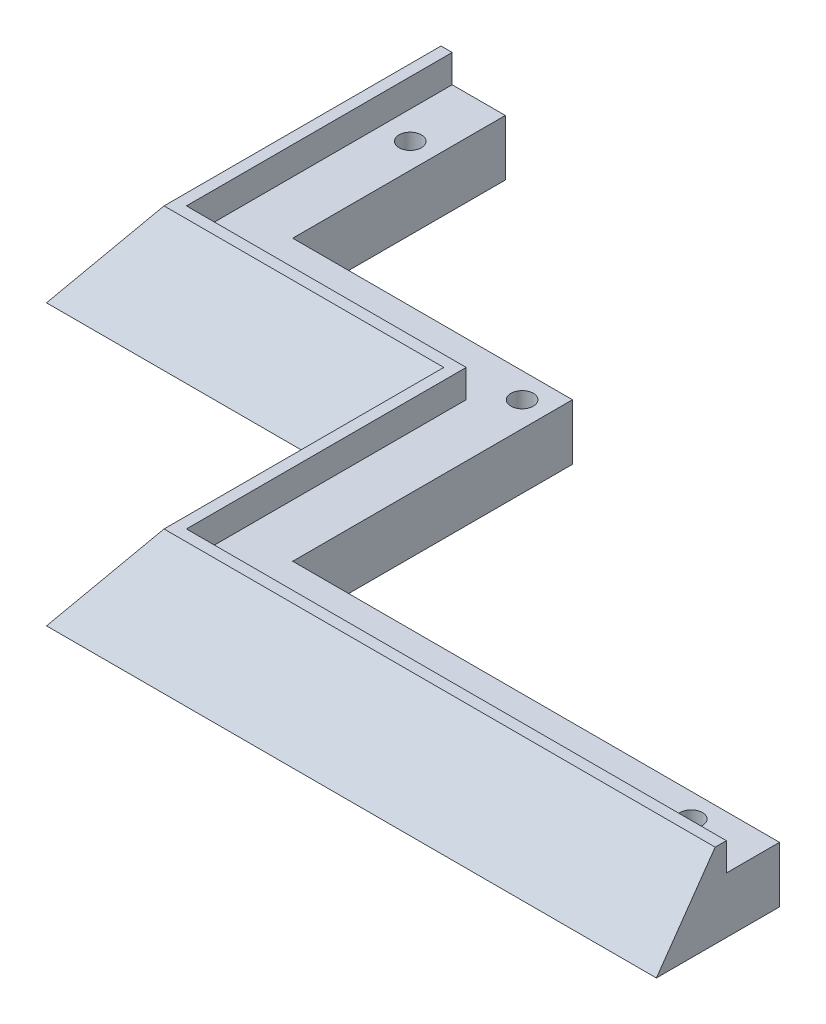
ISO-10303-21;
HEADER;
FILE_DESCRIPTION(('STEP AP214'),'2;1');
FILE_NAME('part.step','',(''),(''),'','','');
FILE_SCHEMA(('AUTOMOTIVE_DESIGN { 1 0 10303 214 1 1 1 1 }'));
ENDSEC;
DATA;
#1=APPLICATION_CONTEXT('core data for automotive mechanical design processes');
#2=APPLICATION_PROTOCOL_DEFINITION('international standard','automotive_design',2000,#1);
#3=PRODUCT_CONTEXT('',#1,'mechanical');
#4=PRODUCT('Part','Part','',(#3));
#5=PRODUCT_RELATED_PRODUCT_CATEGORY('part','',(#4));
#6=PRODUCT_DEFINITION_FORMATION('','',#4);
#7=PRODUCT_DEFINITION_CONTEXT('part definition',#1,'design');
#8=PRODUCT_DEFINITION('design','',#6,#7);
#9=PRODUCT_DEFINITION_SHAPE('','',#8);
#10=(LENGTH_UNIT() NAMED_UNIT(*) SI_UNIT(.MILLI.,.METRE.));
#11=(NAMED_UNIT(*) PLANE_ANGLE_UNIT() SI_UNIT($,.RADIAN.));
#12=(NAMED_UNIT(*) SI_UNIT($,.STERADIAN.) SOLID_ANGLE_UNIT());
#13=UNCERTAINTY_MEASURE_WITH_UNIT(LENGTH_MEASURE(1.E-05),#10,'distance_accuracy_value','');
#14=(GEOMETRIC_REPRESENTATION_CONTEXT(3) GLOBAL_UNCERTAINTY_ASSIGNED_CONTEXT((#13)) GLOBAL_UNIT_ASSIGNED_CONTEXT((#10,
#11,#12)) REPRESENTATION_CONTEXT('',''));
#15=CARTESIAN_POINT('',(0.,0.,0.));
#16=DIRECTION('',(0.,0.,1.));
#17=DIRECTION('',(1.,0.,0.));
#18=AXIS2_PLACEMENT_3D('',#15,#16,#17);
#19=CARTESIAN_POINT('',(117.64765108873,15.,68.6476510887299));
#20=DIRECTION('',(-1.,0.,0.));
#21=DIRECTION('',(0.,0.,1.));
#22=AXIS2_PLACEMENT_3D('',#19,#20,#21);
#23=PLANE('',#22);
#24=DIRECTION('',(0.,0.,-1.));
#25=VECTOR('',#24,1.);
#26=CARTESIAN_POINT('',(117.64765108873,10.,56.1403822311179));
#27=LINE('',#26,#25);
#28=CARTESIAN_POINT('',(117.64765108873,10.,56.1403822311179));
#29=VERTEX_POINT('',#28);
#30=CARTESIAN_POINT('',(117.64765108873,10.,46.6476510887299));
#31=VERTEX_POINT('',#30);
#32=EDGE_CURVE('E178',#29,#31,#27,.T.);
#33=ORIENTED_EDGE('',*,*,#32,.F.);
#34=DIRECTION('',(0.,1.,0.));
#35=VECTOR('',#34,1.);
#36=CARTESIAN_POINT('',(117.64765108873,10.,56.1403822311179));
#37=LINE('',#36,#35);
#38=CARTESIAN_POINT('',(117.64765108873,15.,56.1403822311179));
#39=VERTEX_POINT('',#38);
#40=EDGE_CURVE('E198',#29,#39,#37,.T.);
#41=ORIENTED_EDGE('',*,*,#40,.T.);
#42=DIRECTION('',(0.,0.,-1.));
#43=VECTOR('',#42,1.);
#44=CARTESIAN_POINT('',(117.64765108873,15.,68.6476510887299));
#45=LINE('',#44,#43);
#46=CARTESIAN_POINT('',(117.64765108873,15.,58.1445380155843));
#47=VERTEX_POINT('',#46);
#48=EDGE_CURVE('E222',#47,#39,#45,.T.);
#49=ORIENTED_EDGE('',*,*,#48,.F.);
#50=DIRECTION('',(0.,-0.819152044288993,0.573576436351044));
#51=VECTOR('',#50,1.);
#52=CARTESIAN_POINT('',(117.64765108873,15.,58.1445380155843));
#53=LINE('',#52,#51);
#54=CARTESIAN_POINT('',(117.64765108873,0.,68.6476510887299));
#55=VERTEX_POINT('',#54);
#56=EDGE_CURVE('E45',#47,#55,#53,.T.);
#57=ORIENTED_EDGE('',*,*,#56,.T.);
#58=DIRECTION('',(0.,0.,-1.));
#59=VECTOR('',#58,1.);
#60=CARTESIAN_POINT('',(117.64765108873,0.,68.6476510887299));
#61=LINE('',#60,#59);
#62=CARTESIAN_POINT('',(117.64765108873,0.,46.6476510887299));
#63=VERTEX_POINT('',#62);
#64=EDGE_CURVE('E241',#55,#63,#61,.T.);
#65=ORIENTED_EDGE('',*,*,#64,.T.);
#66=DIRECTION('',(0.,-1.,0.));
#67=VECTOR('',#66,1.);
#68=CARTESIAN_POINT('',(117.64765108873,15.,46.6476510887299));
#69=LINE('',#68,#67);
#70=EDGE_CURVE('E264',#31,#63,#69,.T.);
#71=ORIENTED_EDGE('',*,*,#70,.F.);
#72=EDGE_LOOP('',(#33,#41,#49,#57,#65,#71));
#73=FACE_BOUND('',#72,.T.);
#74=ADVANCED_FACE('F35',(#73),#23,.F.);
#75=CARTESIAN_POINT('',(30.6476510887299,15.,46.6476510887299));
#76=DIRECTION('',(0.,0.,1.));
#77=DIRECTION('',(1.,0.,0.));
#78=AXIS2_PLACEMENT_3D('',#75,#76,#77);
#79=PLANE('',#78);
#80=DIRECTION('',(0.,-1.,0.));
#81=VECTOR('',#80,1.);
#82=CARTESIAN_POINT('',(30.6476510887299,15.,46.6476510887299));
#83=LINE('',#82,#81);
#84=CARTESIAN_POINT('',(30.6476510887299,10.,46.6476510887299));
#85=VERTEX_POINT('',#84);
#86=CARTESIAN_POINT('',(30.6476510887299,0.,46.6476510887299));
#87=VERTEX_POINT('',#86);
#88=EDGE_CURVE('E262',#85,#87,#83,.T.);
#89=ORIENTED_EDGE('',*,*,#88,.F.);
#90=DIRECTION('',(-1.,0.,0.));
#91=VECTOR('',#90,1.);
#92=CARTESIAN_POINT('',(117.64765108873,10.,46.6476510887299));
#93=LINE('',#92,#91);
#94=EDGE_CURVE('E180',#31,#85,#93,.T.);
#95=ORIENTED_EDGE('',*,*,#94,.F.);
#96=ORIENTED_EDGE('',*,*,#70,.T.);
#97=DIRECTION('',(-1.,0.,0.));
#98=VECTOR('',#97,1.);
#99=CARTESIAN_POINT('',(30.6476510887299,0.,46.6476510887299));
#100=LINE('',#99,#98);
#101=EDGE_CURVE('E244',#63,#87,#100,.T.);
#102=ORIENTED_EDGE('',*,*,#101,.T.);
#103=EDGE_LOOP('',(#89,#95,#96,#102));
#104=FACE_BOUND('',#103,.T.);
#105=ADVANCED_FACE('F330',(#104),#79,.F.);
#106=CARTESIAN_POINT('',(30.6476510887299,15.,-3.3523489112701));
#107=DIRECTION('',(-1.,0.,0.));
#108=DIRECTION('',(0.,0.,1.));
#109=AXIS2_PLACEMENT_3D('',#106,#107,#108);
#110=PLANE('',#109);
#111=DIRECTION('',(0.,-1.,0.));
#112=VECTOR('',#111,1.);
#113=CARTESIAN_POINT('',(30.6476510887299,15.,-3.3523489112701));
#114=LINE('',#113,#112);
#115=CARTESIAN_POINT('',(30.6476510887299,10.,-3.3523489112701));
#116=VERTEX_POINT('',#115);
#117=CARTESIAN_POINT('',(30.6476510887299,0.,-3.3523489112701));
#118=VERTEX_POINT('',#117);
#119=EDGE_CURVE('E260',#116,#118,#114,.T.);
#120=ORIENTED_EDGE('',*,*,#119,.F.);
#121=DIRECTION('',(0.,0.,-1.));
#122=VECTOR('',#121,1.);
#123=CARTESIAN_POINT('',(30.6476510887299,10.,-3.3523489112701));
#124=LINE('',#123,#122);
#125=EDGE_CURVE('E182',#85,#116,#124,.T.);
#126=ORIENTED_EDGE('',*,*,#125,.F.);
#127=ORIENTED_EDGE('',*,*,#88,.T.);
#128=DIRECTION('',(0.,0.,-1.));
#129=VECTOR('',#128,1.);
#130=CARTESIAN_POINT('',(30.6476510887299,0.,-3.3523489112701));
#131=LINE('',#130,#129);
#132=EDGE_CURVE('E247',#87,#118,#131,.T.);
#133=ORIENTED_EDGE('',*,*,#132,.T.);
#134=EDGE_LOOP('',(#120,#126,#127,#133));
#135=FACE_BOUND('',#134,.T.);
#136=ADVANCED_FACE('F327',(#135),#110,.F.);
#137=CARTESIAN_POINT('',(-19.3523489112701,15.,-3.3523489112701));
#138=DIRECTION('',(0.,0.,1.));
#139=DIRECTION('',(1.,0.,0.));
#140=AXIS2_PLACEMENT_3D('',#137,#138,#139);
#141=PLANE('',#140);
#142=DIRECTION('',(0.,-1.,0.));
#143=VECTOR('',#142,1.);
#144=CARTESIAN_POINT('',(-19.3523489112701,15.,-3.3523489112701));
#145=LINE('',#144,#143);
#146=CARTESIAN_POINT('',(-19.3523489112701,10.,-3.3523489112701));
#147=VERTEX_POINT('',#146);
#148=CARTESIAN_POINT('',(-19.3523489112701,0.,-3.3523489112701));
#149=VERTEX_POINT('',#148);
#150=EDGE_CURVE('E258',#147,#149,#145,.T.);
#151=ORIENTED_EDGE('',*,*,#150,.F.);
#152=DIRECTION('',(-1.,0.,0.));
#153=VECTOR('',#152,1.);
#154=CARTESIAN_POINT('',(-19.3523489112701,10.,-3.3523489112701));
#155=LINE('',#154,#153);
#156=EDGE_CURVE('E184',#116,#147,#155,.T.);
#157=ORIENTED_EDGE('',*,*,#156,.F.);
#158=ORIENTED_EDGE('',*,*,#119,.T.);
#159=DIRECTION('',(-1.,0.,0.));
#160=VECTOR('',#159,1.);
#161=CARTESIAN_POINT('',(-19.3523489112701,0.,-3.3523489112701));
#162=LINE('',#161,#160);
#163=EDGE_CURVE('E250',#118,#149,#162,.T.);
#164=ORIENTED_EDGE('',*,*,#163,.T.);
#165=EDGE_LOOP('',(#151,#157,#158,#164));
#166=FACE_BOUND('',#165,.T.);
#167=ADVANCED_FACE('F322',(#166),#141,.F.);
#168=CARTESIAN_POINT('',(-19.3523489112701,15.,-41.3523489112701));
#169=DIRECTION('',(-1.,0.,0.));
#170=DIRECTION('',(0.,0.,1.));
#171=AXIS2_PLACEMENT_3D('',#168,#169,#170);
#172=PLANE('',#171);
#173=DIRECTION('',(0.,-1.,0.));
#174=VECTOR('',#173,1.);
#175=CARTESIAN_POINT('',(-19.3523489112701,15.,-41.3523489112701));
#176=LINE('',#175,#174);
#177=CARTESIAN_POINT('',(-19.3523489112701,10.,-41.3523489112701));
#178=VERTEX_POINT('',#177);
#179=CARTESIAN_POINT('',(-19.3523489112701,0.,-41.3523489112701));
#180=VERTEX_POINT('',#179);
#181=EDGE_CURVE('E228',#178,#180,#176,.T.);
#182=ORIENTED_EDGE('',*,*,#181,.F.);
#183=DIRECTION('',(0.,0.,-1.));
#184=VECTOR('',#183,1.);
#185=CARTESIAN_POINT('',(-19.3523489112701,10.,-41.3523489112701));
#186=LINE('',#185,#184);
#187=EDGE_CURVE('E186',#147,#178,#186,.T.);
#188=ORIENTED_EDGE('',*,*,#187,.F.);
#189=ORIENTED_EDGE('',*,*,#150,.T.);
#190=DIRECTION('',(0.,0.,-1.));
#191=VECTOR('',#190,1.);
#192=CARTESIAN_POINT('',(-19.3523489112701,0.,-41.3523489112701));
#193=LINE('',#192,#191);
#194=EDGE_CURVE('E253',#149,#180,#193,.T.);
#195=ORIENTED_EDGE('',*,*,#194,.T.);
#196=EDGE_LOOP('',(#182,#188,#189,#195));
#197=FACE_BOUND('',#196,.T.);
#198=ADVANCED_FACE('F316',(#197),#172,.F.);
#199=CARTESIAN_POINT('',(-19.3523489112701,15.,-41.3523489112701));
#200=DIRECTION('',(0.,0.,1.));
#201=DIRECTION('',(1.,0.,0.));
#202=AXIS2_PLACEMENT_3D('',#199,#200,#201);
#203=PLANE('',#202);
#204=DIRECTION('',(-1.,0.,0.));
#205=VECTOR('',#204,1.);
#206=CARTESIAN_POINT('',(-19.3523489112701,15.,-41.3523489112701));
#207=LINE('',#206,#205);
#208=CARTESIAN_POINT('',(-28.8492358381245,15.,-41.3523489112701));
#209=VERTEX_POINT('',#208);
#210=CARTESIAN_POINT('',(-30.8492358381245,15.,-41.3523489112701));
#211=VERTEX_POINT('',#210);
#212=EDGE_CURVE('E225',#209,#211,#207,.T.);
#213=ORIENTED_EDGE('',*,*,#212,.F.);
#214=DIRECTION('',(0.,1.,0.));
#215=VECTOR('',#214,1.);
#216=CARTESIAN_POINT('',(-28.8492358381245,10.,-41.3523489112701));
#217=LINE('',#216,#215);
#218=CARTESIAN_POINT('',(-28.8492358381245,10.,-41.3523489112701));
#219=VERTEX_POINT('',#218);
#220=EDGE_CURVE('E195',#219,#209,#217,.T.);
#221=ORIENTED_EDGE('',*,*,#220,.F.);
#222=DIRECTION('',(-1.,0.,0.));
#223=VECTOR('',#222,1.);
#224=CARTESIAN_POINT('',(-28.8492358381245,10.,-41.3523489112701));
#225=LINE('',#224,#223);
#226=EDGE_CURVE('E153',#178,#219,#225,.T.);
#227=ORIENTED_EDGE('',*,*,#226,.F.);
#228=ORIENTED_EDGE('',*,*,#181,.T.);
#229=DIRECTION('',(-1.,0.,0.));
#230=VECTOR('',#229,1.);
#231=CARTESIAN_POINT('',(-19.3523489112701,0.,-41.3523489112701));
#232=LINE('',#231,#230);
#233=CARTESIAN_POINT('',(-41.3523489112701,0.,-41.3523489112701));
#234=VERTEX_POINT('',#233);
#235=EDGE_CURVE('E226',#180,#234,#232,.T.);
#236=ORIENTED_EDGE('',*,*,#235,.T.);
#237=DIRECTION('',(0.573576436351044,0.819152044288993,0.));
#238=VECTOR('',#237,1.);
#239=CARTESIAN_POINT('',(-30.8492358381245,15.,-41.3523489112701));
#240=LINE('',#239,#238);
#241=EDGE_CURVE('E11',#234,#211,#240,.T.);
#242=ORIENTED_EDGE('',*,*,#241,.T.);
#243=EDGE_LOOP('',(#213,#221,#227,#228,#236,#242));
#244=FACE_BOUND('',#243,.T.);
#245=ADVANCED_FACE('F312',(#244),#203,.F.);
#246=CARTESIAN_POINT('',(0.,15.,0.));
#247=DIRECTION('',(0.,1.,0.));
#248=DIRECTION('',(0.,0.,1.));
#249=AXIS2_PLACEMENT_3D('',#246,#247,#248);
#250=PLANE('',#249);
#251=DIRECTION('',(0.,0.,1.));
#252=VECTOR('',#251,1.);
#253=CARTESIAN_POINT('',(-28.8492358381245,15.,6.14453801558427));
#254=LINE('',#253,#252);
#255=CARTESIAN_POINT('',(-28.8492358381245,15.,6.14453801558427));
#256=VERTEX_POINT('',#255);
#257=EDGE_CURVE('E53',#209,#256,#254,.T.);
#258=ORIENTED_EDGE('',*,*,#257,.F.);
#259=ORIENTED_EDGE('',*,*,#212,.T.);
#260=DIRECTION('',(0.,0.,1.));
#261=VECTOR('',#260,1.);
#262=CARTESIAN_POINT('',(-30.8492358381245,15.,18.6476510887299));
#263=LINE('',#262,#261);
#264=CARTESIAN_POINT('',(-30.8492358381245,15.,8.14453801558428));
#265=VERTEX_POINT('',#264);
#266=EDGE_CURVE('E266',#211,#265,#263,.T.);
#267=ORIENTED_EDGE('',*,*,#266,.T.);
#268=DIRECTION('',(1.,0.,0.));
#269=VECTOR('',#268,1.);
#270=CARTESIAN_POINT('',(8.6476510887299,15.,8.14453801558428));
#271=LINE('',#270,#269);
#272=CARTESIAN_POINT('',(19.1507641618755,15.,8.14453801558428));
#273=VERTEX_POINT('',#272);
#274=EDGE_CURVE('E268',#265,#273,#271,.T.);
#275=ORIENTED_EDGE('',*,*,#274,.T.);
#276=DIRECTION('',(0.,0.,1.));
#277=VECTOR('',#276,1.);
#278=CARTESIAN_POINT('',(19.1507641618755,15.,68.6476510887299));
#279=LINE('',#278,#277);
#280=CARTESIAN_POINT('',(19.1507641618755,15.,58.1445380155843));
#281=VERTEX_POINT('',#280);
#282=EDGE_CURVE('E61',#273,#281,#279,.T.);
#283=ORIENTED_EDGE('',*,*,#282,.T.);
#284=DIRECTION('',(1.,0.,0.));
#285=VECTOR('',#284,1.);
#286=CARTESIAN_POINT('',(117.64765108873,15.,58.1445380155843));
#287=LINE('',#286,#285);
#288=EDGE_CURVE('E271',#281,#47,#287,.T.);
#289=ORIENTED_EDGE('',*,*,#288,.T.);
#290=ORIENTED_EDGE('',*,*,#48,.T.);
#291=DIRECTION('',(1.,0.,0.));
#292=VECTOR('',#291,1.);
#293=CARTESIAN_POINT('',(21.1507641618755,15.,56.1403822311179));
#294=LINE('',#293,#292);
#295=CARTESIAN_POINT('',(21.1507641618755,15.,56.1403822311179));
#296=VERTEX_POINT('',#295);
#297=EDGE_CURVE('E166',#296,#39,#294,.T.);
#298=ORIENTED_EDGE('',*,*,#297,.F.);
#299=DIRECTION('',(0.,0.,1.));
#300=VECTOR('',#299,1.);
#301=CARTESIAN_POINT('',(21.1507641618755,15.,56.1403822311179));
#302=LINE('',#301,#300);
#303=CARTESIAN_POINT('',(21.1507641618755,15.,6.14453801558427));
#304=VERTEX_POINT('',#303);
#305=EDGE_CURVE('E168',#304,#296,#302,.T.);
#306=ORIENTED_EDGE('',*,*,#305,.F.);
#307=DIRECTION('',(1.,0.,0.));
#308=VECTOR('',#307,1.);
#309=CARTESIAN_POINT('',(21.1507641618755,15.,6.14453801558427));
#310=LINE('',#309,#308);
#311=EDGE_CURVE('E190',#256,#304,#310,.T.);
#312=ORIENTED_EDGE('',*,*,#311,.F.);
#313=EDGE_LOOP('',(#258,#259,#267,#275,#283,#289,#290,#298,#306,#312));
#314=FACE_BOUND('',#313,.T.);
#315=ADVANCED_FACE('F298',(#314),#250,.T.);
#316=CARTESIAN_POINT('',(0.,0.,0.));
#317=DIRECTION('',(0.,1.,0.));
#318=DIRECTION('',(0.,0.,1.));
#319=AXIS2_PLACEMENT_3D('',#316,#317,#318);
#320=PLANE('',#319);
#321=CARTESIAN_POINT('',(38.6476510887299,0.,63.6476510887299));
#322=DIRECTION('',(0.,-1.,0.));
#323=DIRECTION('',(0.,0.,-1.));
#324=AXIS2_PLACEMENT_3D('',#321,#322,#323);
#325=CIRCLE('',#324,2.);
#326=CARTESIAN_POINT('',(38.6476510887299,0.,61.6476510887299));
#327=VERTEX_POINT('',#326);
#328=EDGE_CURVE('E208',#327,#327,#325,.T.);
#329=ORIENTED_EDGE('',*,*,#328,.F.);
#330=EDGE_LOOP('',(#329));
#331=FACE_BOUND('',#330,.T.);
#332=CARTESIAN_POINT('',(13.6476510887299,0.,38.6476510887299));
#333=DIRECTION('',(0.,-1.,0.));
#334=DIRECTION('',(0.,0.,-1.));
#335=AXIS2_PLACEMENT_3D('',#332,#333,#334);
#336=CIRCLE('',#335,2.);
#337=CARTESIAN_POINT('',(13.6476510887299,0.,36.6476510887299));
#338=VERTEX_POINT('',#337);
#339=EDGE_CURVE('E214',#338,#338,#336,.T.);
#340=ORIENTED_EDGE('',*,*,#339,.F.);
#341=EDGE_LOOP('',(#340));
#342=FACE_BOUND('',#341,.T.);
#343=CARTESIAN_POINT('',(-11.3523489112701,0.,13.6476510887299));
#344=DIRECTION('',(0.,-1.,0.));
#345=DIRECTION('',(0.,0.,-1.));
#346=AXIS2_PLACEMENT_3D('',#343,#344,#345);
#347=CIRCLE('',#346,2.);
#348=CARTESIAN_POINT('',(-11.3523489112701,0.,11.6476510887299));
#349=VERTEX_POINT('',#348);
#350=EDGE_CURVE('E197',#349,#349,#347,.T.);
#351=ORIENTED_EDGE('',*,*,#350,.F.);
#352=EDGE_LOOP('',(#351));
#353=FACE_BOUND('',#352,.T.);
#354=DIRECTION('',(0.,0.,1.));
#355=VECTOR('',#354,1.);
#356=CARTESIAN_POINT('',(-41.3523489112701,0.,18.6476510887299));
#357=LINE('',#356,#355);
#358=CARTESIAN_POINT('',(-41.3523489112701,0.,18.6476510887299));
#359=VERTEX_POINT('',#358);
#360=EDGE_CURVE('E229',#234,#359,#357,.T.);
#361=ORIENTED_EDGE('',*,*,#360,.F.);
#362=ORIENTED_EDGE('',*,*,#235,.F.);
#363=ORIENTED_EDGE('',*,*,#194,.F.);
#364=ORIENTED_EDGE('',*,*,#163,.F.);
#365=ORIENTED_EDGE('',*,*,#132,.F.);
#366=ORIENTED_EDGE('',*,*,#101,.F.);
#367=ORIENTED_EDGE('',*,*,#64,.F.);
#368=DIRECTION('',(1.,0.,0.));
#369=VECTOR('',#368,1.);
#370=CARTESIAN_POINT('',(68.6476510887299,0.,68.6476510887299));
#371=LINE('',#370,#369);
#372=CARTESIAN_POINT('',(8.64765108872991,0.,68.6476510887299));
#373=VERTEX_POINT('',#372);
#374=EDGE_CURVE('E238',#373,#55,#371,.T.);
#375=ORIENTED_EDGE('',*,*,#374,.F.);
#376=DIRECTION('',(0.,0.,1.));
#377=VECTOR('',#376,1.);
#378=CARTESIAN_POINT('',(8.6476510887299,0.,18.6476510887299));
#379=LINE('',#378,#377);
#380=CARTESIAN_POINT('',(8.6476510887299,0.,18.6476510887299));
#381=VERTEX_POINT('',#380);
#382=EDGE_CURVE('E235',#381,#373,#379,.T.);
#383=ORIENTED_EDGE('',*,*,#382,.F.);
#384=DIRECTION('',(1.,0.,0.));
#385=VECTOR('',#384,1.);
#386=CARTESIAN_POINT('',(-41.3523489112701,0.,18.6476510887299));
#387=LINE('',#386,#385);
#388=EDGE_CURVE('E232',#359,#381,#387,.T.);
#389=ORIENTED_EDGE('',*,*,#388,.F.);
#390=EDGE_LOOP('',(#361,#362,#363,#364,#365,#366,#367,#375,#383,#389));
#391=FACE_BOUND('',#390,.T.);
#392=ADVANCED_FACE('F290',(#331,#342,#353,#391),#320,.F.);
#393=CARTESIAN_POINT('',(-30.8492358381245,15.,0.));
#394=DIRECTION('',(-0.819152044288993,0.573576436351044,0.));
#395=DIRECTION('',(0.,0.,-1.));
#396=AXIS2_PLACEMENT_3D('',#393,#394,#395);
#397=PLANE('',#396);
#398=ORIENTED_EDGE('',*,*,#241,.F.);
#399=ORIENTED_EDGE('',*,*,#360,.T.);
#400=DIRECTION('',(0.497542812164522,0.710564775461632,-0.497542812164522));
#401=VECTOR('',#400,1.);
#402=CARTESIAN_POINT('',(-28.8330648191018,17.8793906220684,6.12836699656163));
#403=LINE('',#402,#401);
#404=EDGE_CURVE('E40',#265,#359,#403,.F.);
#405=ORIENTED_EDGE('',*,*,#404,.F.);
#406=ORIENTED_EDGE('',*,*,#266,.F.);
#407=EDGE_LOOP('',(#398,#399,#405,#406));
#408=FACE_BOUND('',#407,.T.);
#409=ADVANCED_FACE('F38',(#408),#397,.T.);
#410=CARTESIAN_POINT('',(0.,15.,8.14453801558428));
#411=DIRECTION('',(0.,0.573576436351044,0.819152044288993));
#412=DIRECTION('',(-1.,0.,0.));
#413=AXIS2_PLACEMENT_3D('',#410,#411,#412);
#414=PLANE('',#413);
#415=ORIENTED_EDGE('',*,*,#404,.T.);
#416=ORIENTED_EDGE('',*,*,#388,.T.);
#417=DIRECTION('',(0.497542812164522,0.710564775461632,-0.497542812164522));
#418=VECTOR('',#417,1.);
#419=CARTESIAN_POINT('',(21.1669351808982,17.8793906220684,6.12836699656163));
#420=LINE('',#419,#418);
#421=EDGE_CURVE('E275',#273,#381,#420,.F.);
#422=ORIENTED_EDGE('',*,*,#421,.F.);
#423=ORIENTED_EDGE('',*,*,#274,.F.);
#424=EDGE_LOOP('',(#415,#416,#422,#423));
#425=FACE_BOUND('',#424,.T.);
#426=ADVANCED_FACE('F283',(#425),#414,.T.);
#427=CARTESIAN_POINT('',(19.1507641618755,15.,0.));
#428=DIRECTION('',(-0.819152044288993,0.573576436351044,0.));
#429=DIRECTION('',(0.,0.,-1.));
#430=AXIS2_PLACEMENT_3D('',#427,#428,#429);
#431=PLANE('',#430);
#432=ORIENTED_EDGE('',*,*,#421,.T.);
#433=ORIENTED_EDGE('',*,*,#382,.T.);
#434=DIRECTION('',(0.497542812164522,0.710564775461632,-0.497542812164522));
#435=VECTOR('',#434,1.);
#436=CARTESIAN_POINT('',(33.5443776777272,35.55621045248,43.7509244997326));
#437=LINE('',#436,#435);
#438=EDGE_CURVE('E207',#281,#373,#437,.F.);
#439=ORIENTED_EDGE('',*,*,#438,.F.);
#440=ORIENTED_EDGE('',*,*,#282,.F.);
#441=EDGE_LOOP('',(#432,#433,#439,#440));
#442=FACE_BOUND('',#441,.T.);
#443=ADVANCED_FACE('F293',(#442),#431,.T.);
#444=CARTESIAN_POINT('',(0.,15.,58.1445380155843));
#445=DIRECTION('',(0.,0.573576436351044,0.819152044288993));
#446=DIRECTION('',(-1.,0.,0.));
#447=AXIS2_PLACEMENT_3D('',#444,#445,#446);
#448=PLANE('',#447);
#449=ORIENTED_EDGE('',*,*,#438,.T.);
#450=ORIENTED_EDGE('',*,*,#374,.T.);
#451=ORIENTED_EDGE('',*,*,#56,.F.);
#452=ORIENTED_EDGE('',*,*,#288,.F.);
#453=EDGE_LOOP('',(#449,#450,#451,#452));
#454=FACE_BOUND('',#453,.T.);
#455=ADVANCED_FACE('F296',(#454),#448,.T.);
#456=CARTESIAN_POINT('',(-11.3523489112701,4.,13.6476510887299));
#457=DIRECTION('',(0.,-1.,0.));
#458=DIRECTION('',(0.,0.,-1.));
#459=AXIS2_PLACEMENT_3D('',#456,#457,#458);
#460=CYLINDRICAL_SURFACE('',#459,2.);
#461=CARTESIAN_POINT('',(-11.3523489112701,4.,13.6476510887299));
#462=DIRECTION('',(0.,-1.,0.));
#463=DIRECTION('',(0.,0.,-1.));
#464=AXIS2_PLACEMENT_3D('',#461,#462,#463);
#465=CIRCLE('',#464,2.);
#466=CARTESIAN_POINT('',(-11.3523489112701,4.,11.6476510887299));
#467=VERTEX_POINT('',#466);
#468=EDGE_CURVE('E217',#467,#467,#465,.T.);
#469=ORIENTED_EDGE('',*,*,#468,.F.);
#470=EDGE_LOOP('',(#469));
#471=FACE_BOUND('',#470,.T.);
#472=ORIENTED_EDGE('',*,*,#350,.T.);
#473=EDGE_LOOP('',(#472));
#474=FACE_BOUND('',#473,.T.);
#475=ADVANCED_FACE('F347',(#471,#474),#460,.F.);
#476=CARTESIAN_POINT('',(-11.3523489112701,4.,13.6476510887299));
#477=DIRECTION('',(0.,-1.,0.));
#478=DIRECTION('',(0.,0.,-1.));
#479=AXIS2_PLACEMENT_3D('',#476,#477,#478);
#480=PLANE('',#479);
#481=ORIENTED_EDGE('',*,*,#468,.T.);
#482=EDGE_LOOP('',(#481));
#483=FACE_BOUND('',#482,.T.);
#484=ADVANCED_FACE('F515',(#483),#480,.T.);
#485=CARTESIAN_POINT('',(13.6476510887299,4.,38.6476510887299));
#486=DIRECTION('',(0.,-1.,0.));
#487=DIRECTION('',(0.,0.,-1.));
#488=AXIS2_PLACEMENT_3D('',#485,#486,#487);
#489=CYLINDRICAL_SURFACE('',#488,2.);
#490=CARTESIAN_POINT('',(13.6476510887299,4.,38.6476510887299));
#491=DIRECTION('',(0.,-1.,0.));
#492=DIRECTION('',(0.,0.,-1.));
#493=AXIS2_PLACEMENT_3D('',#490,#491,#492);
#494=CIRCLE('',#493,2.);
#495=CARTESIAN_POINT('',(13.6476510887299,4.,36.6476510887299));
#496=VERTEX_POINT('',#495);
#497=EDGE_CURVE('E211',#496,#496,#494,.T.);
#498=ORIENTED_EDGE('',*,*,#497,.F.);
#499=EDGE_LOOP('',(#498));
#500=FACE_BOUND('',#499,.T.);
#501=ORIENTED_EDGE('',*,*,#339,.T.);
#502=EDGE_LOOP('',(#501));
#503=FACE_BOUND('',#502,.T.);
#504=ADVANCED_FACE('F511',(#500,#503),#489,.F.);
#505=CARTESIAN_POINT('',(13.6476510887299,4.,38.6476510887299));
#506=DIRECTION('',(0.,-1.,0.));
#507=DIRECTION('',(0.,0.,-1.));
#508=AXIS2_PLACEMENT_3D('',#505,#506,#507);
#509=PLANE('',#508);
#510=ORIENTED_EDGE('',*,*,#497,.T.);
#511=EDGE_LOOP('',(#510));
#512=FACE_BOUND('',#511,.T.);
#513=ADVANCED_FACE('F507',(#512),#509,.T.);
#514=CARTESIAN_POINT('',(38.6476510887299,4.,63.6476510887299));
#515=DIRECTION('',(0.,-1.,0.));
#516=DIRECTION('',(0.,0.,-1.));
#517=AXIS2_PLACEMENT_3D('',#514,#515,#516);
#518=CYLINDRICAL_SURFACE('',#517,2.);
#519=CARTESIAN_POINT('',(38.6476510887299,4.,63.6476510887299));
#520=DIRECTION('',(0.,-1.,0.));
#521=DIRECTION('',(0.,0.,-1.));
#522=AXIS2_PLACEMENT_3D('',#519,#520,#521);
#523=CIRCLE('',#522,2.);
#524=CARTESIAN_POINT('',(38.6476510887299,4.,61.6476510887299));
#525=VERTEX_POINT('',#524);
#526=EDGE_CURVE('E204',#525,#525,#523,.T.);
#527=ORIENTED_EDGE('',*,*,#526,.F.);
#528=EDGE_LOOP('',(#527));
#529=FACE_BOUND('',#528,.T.);
#530=ORIENTED_EDGE('',*,*,#328,.T.);
#531=EDGE_LOOP('',(#530));
#532=FACE_BOUND('',#531,.T.);
#533=ADVANCED_FACE('F503',(#529,#532),#518,.F.);
#534=CARTESIAN_POINT('',(38.6476510887299,4.,63.6476510887299));
#535=DIRECTION('',(0.,-1.,0.));
#536=DIRECTION('',(0.,0.,-1.));
#537=AXIS2_PLACEMENT_3D('',#534,#535,#536);
#538=PLANE('',#537);
#539=ORIENTED_EDGE('',*,*,#526,.T.);
#540=EDGE_LOOP('',(#539));
#541=FACE_BOUND('',#540,.T.);
#542=ADVANCED_FACE('F401',(#541),#538,.T.);
#543=CARTESIAN_POINT('',(-28.8492358381245,10.,6.14453801558427));
#544=DIRECTION('',(-1.,0.,0.));
#545=DIRECTION('',(0.,0.,1.));
#546=AXIS2_PLACEMENT_3D('',#543,#544,#545);
#547=PLANE('',#546);
#548=ORIENTED_EDGE('',*,*,#257,.T.);
#549=DIRECTION('',(0.,1.,0.));
#550=VECTOR('',#549,1.);
#551=CARTESIAN_POINT('',(-28.8492358381245,10.,6.14453801558427));
#552=LINE('',#551,#550);
#553=CARTESIAN_POINT('',(-28.8492358381245,10.,6.14453801558427));
#554=VERTEX_POINT('',#553);
#555=EDGE_CURVE('E143',#554,#256,#552,.T.);
#556=ORIENTED_EDGE('',*,*,#555,.F.);
#557=DIRECTION('',(0.,0.,1.));
#558=VECTOR('',#557,1.);
#559=CARTESIAN_POINT('',(-28.8492358381245,10.,6.14453801558427));
#560=LINE('',#559,#558);
#561=EDGE_CURVE('E147',#219,#554,#560,.T.);
#562=ORIENTED_EDGE('',*,*,#561,.F.);
#563=ORIENTED_EDGE('',*,*,#220,.T.);
#564=EDGE_LOOP('',(#548,#556,#562,#563));
#565=FACE_BOUND('',#564,.T.);
#566=ADVANCED_FACE('F145',(#565),#547,.F.);
#567=CARTESIAN_POINT('',(21.1507641618755,10.,56.1403822311179));
#568=DIRECTION('',(0.,0.,1.));
#569=DIRECTION('',(1.,0.,0.));
#570=AXIS2_PLACEMENT_3D('',#567,#568,#569);
#571=PLANE('',#570);
#572=ORIENTED_EDGE('',*,*,#297,.T.);
#573=ORIENTED_EDGE('',*,*,#40,.F.);
#574=DIRECTION('',(1.,0.,0.));
#575=VECTOR('',#574,1.);
#576=CARTESIAN_POINT('',(21.1507641618755,10.,56.1403822311179));
#577=LINE('',#576,#575);
#578=CARTESIAN_POINT('',(21.1507641618755,10.,56.1403822311179));
#579=VERTEX_POINT('',#578);
#580=EDGE_CURVE('E175',#579,#29,#577,.T.);
#581=ORIENTED_EDGE('',*,*,#580,.F.);
#582=DIRECTION('',(0.,1.,0.));
#583=VECTOR('',#582,1.);
#584=CARTESIAN_POINT('',(21.1507641618755,10.,56.1403822311179));
#585=LINE('',#584,#583);
#586=EDGE_CURVE('E201',#579,#296,#585,.T.);
#587=ORIENTED_EDGE('',*,*,#586,.T.);
#588=EDGE_LOOP('',(#572,#573,#581,#587));
#589=FACE_BOUND('',#588,.T.);
#590=ADVANCED_FACE('F305',(#589),#571,.F.);
#591=CARTESIAN_POINT('',(21.1507641618755,10.,56.1403822311179));
#592=DIRECTION('',(-1.,0.,0.));
#593=DIRECTION('',(0.,0.,1.));
#594=AXIS2_PLACEMENT_3D('',#591,#592,#593);
#595=PLANE('',#594);
#596=ORIENTED_EDGE('',*,*,#305,.T.);
#597=ORIENTED_EDGE('',*,*,#586,.F.);
#598=DIRECTION('',(0.,0.,1.));
#599=VECTOR('',#598,1.);
#600=CARTESIAN_POINT('',(21.1507641618755,10.,56.1403822311179));
#601=LINE('',#600,#599);
#602=CARTESIAN_POINT('',(21.1507641618755,10.,6.14453801558427));
#603=VERTEX_POINT('',#602);
#604=EDGE_CURVE('E161',#603,#579,#601,.T.);
#605=ORIENTED_EDGE('',*,*,#604,.F.);
#606=DIRECTION('',(0.,1.,0.));
#607=VECTOR('',#606,1.);
#608=CARTESIAN_POINT('',(21.1507641618755,10.,6.14453801558427));
#609=LINE('',#608,#607);
#610=EDGE_CURVE('E152',#603,#304,#609,.T.);
#611=ORIENTED_EDGE('',*,*,#610,.T.);
#612=EDGE_LOOP('',(#596,#597,#605,#611));
#613=FACE_BOUND('',#612,.T.);
#614=ADVANCED_FACE('F308',(#613),#595,.F.);
#615=CARTESIAN_POINT('',(21.1507641618755,10.,6.14453801558427));
#616=DIRECTION('',(0.,0.,1.));
#617=DIRECTION('',(1.,0.,0.));
#618=AXIS2_PLACEMENT_3D('',#615,#616,#617);
#619=PLANE('',#618);
#620=ORIENTED_EDGE('',*,*,#311,.T.);
#621=ORIENTED_EDGE('',*,*,#610,.F.);
#622=DIRECTION('',(1.,0.,0.));
#623=VECTOR('',#622,1.);
#624=CARTESIAN_POINT('',(21.1507641618755,10.,6.14453801558427));
#625=LINE('',#624,#623);
#626=EDGE_CURVE('E156',#554,#603,#625,.T.);
#627=ORIENTED_EDGE('',*,*,#626,.F.);
#628=ORIENTED_EDGE('',*,*,#555,.T.);
#629=EDGE_LOOP('',(#620,#621,#627,#628));
#630=FACE_BOUND('',#629,.T.);
#631=ADVANCED_FACE('F157',(#630),#619,.F.);
#632=CARTESIAN_POINT('',(0.,10.,0.));
#633=DIRECTION('',(0.,-1.,0.));
#634=DIRECTION('',(0.,0.,-1.));
#635=AXIS2_PLACEMENT_3D('',#632,#633,#634);
#636=PLANE('',#635);
#637=CARTESIAN_POINT('',(-23.8492358381245,10.,-28.8554619844157));
#638=DIRECTION('',(0.,1.,0.));
#639=DIRECTION('',(0.,0.,1.));
#640=AXIS2_PLACEMENT_3D('',#637,#638,#639);
#641=CIRCLE('',#640,2.);
#642=CARTESIAN_POINT('',(-23.8492358381245,10.,-26.8554619844157));
#643=VERTEX_POINT('',#642);
#644=EDGE_CURVE('E612',#643,#643,#641,.T.);
#645=ORIENTED_EDGE('',*,*,#644,.F.);
#646=EDGE_LOOP('',(#645));
#647=FACE_BOUND('',#646,.T.);
#648=CARTESIAN_POINT('',(26.1507641618755,10.,1.14453801558427));
#649=DIRECTION('',(0.,1.,0.));
#650=DIRECTION('',(0.,0.,1.));
#651=AXIS2_PLACEMENT_3D('',#648,#649,#650);
#652=CIRCLE('',#651,2.);
#653=CARTESIAN_POINT('',(26.1507641618755,10.,3.14453801558427));
#654=VERTEX_POINT('',#653);
#655=EDGE_CURVE('E620',#654,#654,#652,.T.);
#656=ORIENTED_EDGE('',*,*,#655,.F.);
#657=EDGE_LOOP('',(#656));
#658=FACE_BOUND('',#657,.T.);
#659=CARTESIAN_POINT('',(106.150456792027,10.,50.9186186605045));
#660=DIRECTION('',(0.,1.,0.));
#661=DIRECTION('',(0.,0.,1.));
#662=AXIS2_PLACEMENT_3D('',#659,#660,#661);
#663=CIRCLE('',#662,2.);
#664=CARTESIAN_POINT('',(106.150456792027,10.,52.9186186605045));
#665=VERTEX_POINT('',#664);
#666=EDGE_CURVE('E171',#665,#665,#663,.T.);
#667=ORIENTED_EDGE('',*,*,#666,.F.);
#668=EDGE_LOOP('',(#667));
#669=FACE_BOUND('',#668,.T.);
#670=ORIENTED_EDGE('',*,*,#561,.T.);
#671=ORIENTED_EDGE('',*,*,#626,.T.);
#672=ORIENTED_EDGE('',*,*,#604,.T.);
#673=ORIENTED_EDGE('',*,*,#580,.T.);
#674=ORIENTED_EDGE('',*,*,#32,.T.);
#675=ORIENTED_EDGE('',*,*,#94,.T.);
#676=ORIENTED_EDGE('',*,*,#125,.T.);
#677=ORIENTED_EDGE('',*,*,#156,.T.);
#678=ORIENTED_EDGE('',*,*,#187,.T.);
#679=ORIENTED_EDGE('',*,*,#226,.T.);
#680=EDGE_LOOP('',(#670,#671,#672,#673,#674,#675,#676,#677,#678,#679));
#681=FACE_BOUND('',#680,.T.);
#682=ADVANCED_FACE('F163',(#647,#658,#669,#681),#636,.F.);
#683=CARTESIAN_POINT('',(106.150456792027,5.,50.9186186605045));
#684=DIRECTION('',(0.,1.,0.));
#685=DIRECTION('',(0.,0.,1.));
#686=AXIS2_PLACEMENT_3D('',#683,#684,#685);
#687=CYLINDRICAL_SURFACE('',#686,2.);
#688=CARTESIAN_POINT('',(106.150456792027,5.,50.9186186605045));
#689=DIRECTION('',(0.,1.,0.));
#690=DIRECTION('',(0.,0.,1.));
#691=AXIS2_PLACEMENT_3D('',#688,#689,#690);
#692=CIRCLE('',#691,2.);
#693=CARTESIAN_POINT('',(106.150456792027,5.,52.9186186605045));
#694=VERTEX_POINT('',#693);
#695=EDGE_CURVE('E622',#694,#694,#692,.T.);
#696=ORIENTED_EDGE('',*,*,#695,.F.);
#697=EDGE_LOOP('',(#696));
#698=FACE_BOUND('',#697,.T.);
#699=ORIENTED_EDGE('',*,*,#666,.T.);
#700=EDGE_LOOP('',(#699));
#701=FACE_BOUND('',#700,.T.);
#702=ADVANCED_FACE('F436',(#698,#701),#687,.F.);
#703=CARTESIAN_POINT('',(106.150456792027,5.,50.9186186605045));
#704=DIRECTION('',(0.,1.,0.));
#705=DIRECTION('',(0.,0.,1.));
#706=AXIS2_PLACEMENT_3D('',#703,#704,#705);
#707=PLANE('',#706);
#708=ORIENTED_EDGE('',*,*,#695,.T.);
#709=EDGE_LOOP('',(#708));
#710=FACE_BOUND('',#709,.T.);
#711=ADVANCED_FACE('F446',(#710),#707,.T.);
#712=CARTESIAN_POINT('',(26.1507641618755,5.,1.14453801558427));
#713=DIRECTION('',(0.,1.,0.));
#714=DIRECTION('',(0.,0.,1.));
#715=AXIS2_PLACEMENT_3D('',#712,#713,#714);
#716=CYLINDRICAL_SURFACE('',#715,2.);
#717=CARTESIAN_POINT('',(26.1507641618755,5.,1.14453801558427));
#718=DIRECTION('',(0.,1.,0.));
#719=DIRECTION('',(0.,0.,1.));
#720=AXIS2_PLACEMENT_3D('',#717,#718,#719);
#721=CIRCLE('',#720,2.);
#722=CARTESIAN_POINT('',(26.1507641618755,5.,3.14453801558427));
#723=VERTEX_POINT('',#722);
#724=EDGE_CURVE('E615',#723,#723,#721,.T.);
#725=ORIENTED_EDGE('',*,*,#724,.F.);
#726=EDGE_LOOP('',(#725));
#727=FACE_BOUND('',#726,.T.);
#728=ORIENTED_EDGE('',*,*,#655,.T.);
#729=EDGE_LOOP('',(#728));
#730=FACE_BOUND('',#729,.T.);
#731=ADVANCED_FACE('F456',(#727,#730),#716,.F.);
#732=CARTESIAN_POINT('',(26.1507641618755,5.,1.14453801558427));
#733=DIRECTION('',(0.,1.,0.));
#734=DIRECTION('',(0.,0.,1.));
#735=AXIS2_PLACEMENT_3D('',#732,#733,#734);
#736=PLANE('',#735);
#737=ORIENTED_EDGE('',*,*,#724,.T.);
#738=EDGE_LOOP('',(#737));
#739=FACE_BOUND('',#738,.T.);
#740=ADVANCED_FACE('F466',(#739),#736,.T.);
#741=CARTESIAN_POINT('',(-23.8492358381245,5.,-28.8554619844157));
#742=DIRECTION('',(0.,1.,0.));
#743=DIRECTION('',(0.,0.,1.));
#744=AXIS2_PLACEMENT_3D('',#741,#742,#743);
#745=CYLINDRICAL_SURFACE('',#744,2.);
#746=CARTESIAN_POINT('',(-23.8492358381245,5.,-28.8554619844157));
#747=DIRECTION('',(0.,1.,0.));
#748=DIRECTION('',(0.,0.,1.));
#749=AXIS2_PLACEMENT_3D('',#746,#747,#748);
#750=CIRCLE('',#749,2.);
#751=CARTESIAN_POINT('',(-23.8492358381245,5.,-26.8554619844157));
#752=VERTEX_POINT('',#751);
#753=EDGE_CURVE('E191',#752,#752,#750,.T.);
#754=ORIENTED_EDGE('',*,*,#753,.F.);
#755=EDGE_LOOP('',(#754));
#756=FACE_BOUND('',#755,.T.);
#757=ORIENTED_EDGE('',*,*,#644,.T.);
#758=EDGE_LOOP('',(#757));
#759=FACE_BOUND('',#758,.T.);
#760=ADVANCED_FACE('F476',(#756,#759),#745,.F.);
#761=CARTESIAN_POINT('',(-23.8492358381245,5.,-28.8554619844157));
#762=DIRECTION('',(0.,1.,0.));
#763=DIRECTION('',(0.,0.,1.));
#764=AXIS2_PLACEMENT_3D('',#761,#762,#763);
#765=PLANE('',#764);
#766=ORIENTED_EDGE('',*,*,#753,.T.);
#767=EDGE_LOOP('',(#766));
#768=FACE_BOUND('',#767,.T.);
#769=ADVANCED_FACE('F486',(#768),#765,.T.);
#770=CLOSED_SHELL('',(#74,#105,#136,#167,#198,#245,#315,#392,#409,#426,#443,#455,#475,#484,#504,
#513,#533,#542,#566,#590,#614,#631,#682,#702,#711,#731,#740,#760,#769));
#771=MANIFOLD_SOLID_BREP('B2',#770);
#772=ADVANCED_BREP_SHAPE_REPRESENTATION('',(#18,#771),#14);
#773=SHAPE_DEFINITION_REPRESENTATION(#9,#772);
ENDSEC;
END-ISO-10303-21;
